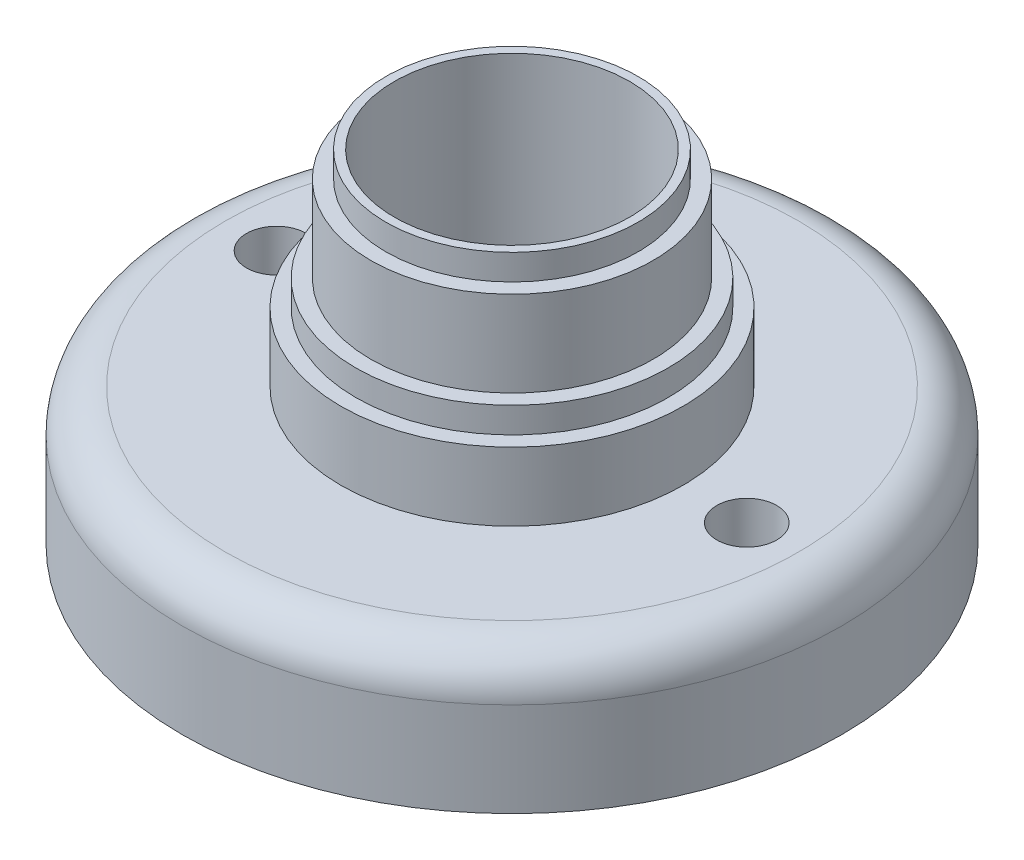
ISO-10303-21;
HEADER;
FILE_DESCRIPTION(('STEP AP214'),'2;1');
FILE_NAME('part.step','',(''),(''),'','','');
FILE_SCHEMA(('AUTOMOTIVE_DESIGN { 1 0 10303 214 1 1 1 1 }'));
ENDSEC;
DATA;
#1=APPLICATION_CONTEXT('core data for automotive mechanical design processes');
#2=APPLICATION_PROTOCOL_DEFINITION('international standard','automotive_design',2000,#1);
#3=PRODUCT_CONTEXT('',#1,'mechanical');
#4=PRODUCT('Part','Part','',(#3));
#5=PRODUCT_RELATED_PRODUCT_CATEGORY('part','',(#4));
#6=PRODUCT_DEFINITION_FORMATION('','',#4);
#7=PRODUCT_DEFINITION_CONTEXT('part definition',#1,'design');
#8=PRODUCT_DEFINITION('design','',#6,#7);
#9=PRODUCT_DEFINITION_SHAPE('','',#8);
#10=(LENGTH_UNIT() NAMED_UNIT(*) SI_UNIT(.MILLI.,.METRE.));
#11=(NAMED_UNIT(*) PLANE_ANGLE_UNIT() SI_UNIT($,.RADIAN.));
#12=(NAMED_UNIT(*) SI_UNIT($,.STERADIAN.) SOLID_ANGLE_UNIT());
#13=UNCERTAINTY_MEASURE_WITH_UNIT(LENGTH_MEASURE(1.E-05),#10,'distance_accuracy_value','');
#14=(GEOMETRIC_REPRESENTATION_CONTEXT(3) GLOBAL_UNCERTAINTY_ASSIGNED_CONTEXT((#13)) GLOBAL_UNIT_ASSIGNED_CONTEXT((#10,
#11,#12)) REPRESENTATION_CONTEXT('',''));
#15=CARTESIAN_POINT('',(0.,0.,0.));
#16=DIRECTION('',(0.,0.,1.));
#17=DIRECTION('',(1.,0.,0.));
#18=AXIS2_PLACEMENT_3D('',#15,#16,#17);
#19=CARTESIAN_POINT('',(0.,16.,0.));
#20=DIRECTION('',(0.,1.,0.));
#21=DIRECTION('',(0.,0.,1.));
#22=AXIS2_PLACEMENT_3D('',#19,#20,#21);
#23=PLANE('',#22);
#24=CARTESIAN_POINT('',(0.,16.,0.));
#25=DIRECTION('',(0.,-1.,0.));
#26=DIRECTION('',(0.,0.,-1.));
#27=AXIS2_PLACEMENT_3D('',#24,#25,#26);
#28=CIRCLE('',#27,13.75);
#29=CARTESIAN_POINT('',(0.,16.,-13.75));
#30=VERTEX_POINT('',#29);
#31=EDGE_CURVE('E20',#30,#30,#28,.F.);
#32=ORIENTED_EDGE('',*,*,#31,.T.);
#33=EDGE_LOOP('',(#32));
#34=FACE_BOUND('',#33,.T.);
#35=ADVANCED_FACE('F17',(#34),#23,.T.);
#36=CARTESIAN_POINT('',(0.,40.,0.));
#37=DIRECTION('',(0.,-1.,0.));
#38=DIRECTION('',(0.,0.,-1.));
#39=AXIS2_PLACEMENT_3D('',#36,#37,#38);
#40=CYLINDRICAL_SURFACE('',#39,13.75);
#41=ORIENTED_EDGE('',*,*,#31,.F.);
#42=EDGE_LOOP('',(#41));
#43=FACE_BOUND('',#42,.T.);
#44=CARTESIAN_POINT('',(0.,40.,0.));
#45=DIRECTION('',(0.,-1.,0.));
#46=DIRECTION('',(0.,0.,-1.));
#47=AXIS2_PLACEMENT_3D('',#44,#45,#46);
#48=CIRCLE('',#47,13.75);
#49=CARTESIAN_POINT('',(0.,40.,-13.75));
#50=VERTEX_POINT('',#49);
#51=EDGE_CURVE('E335',#50,#50,#48,.T.);
#52=ORIENTED_EDGE('',*,*,#51,.F.);
#53=EDGE_LOOP('',(#52));
#54=FACE_BOUND('',#53,.T.);
#55=ADVANCED_FACE('F192',(#43,#54),#40,.F.);
#56=CARTESIAN_POINT('',(0.,40.,0.));
#57=DIRECTION('',(0.,1.,0.));
#58=DIRECTION('',(0.,0.,1.));
#59=AXIS2_PLACEMENT_3D('',#56,#57,#58);
#60=PLANE('',#59);
#61=ORIENTED_EDGE('',*,*,#51,.T.);
#62=EDGE_LOOP('',(#61));
#63=FACE_BOUND('',#62,.T.);
#64=CARTESIAN_POINT('',(0.,40.,0.));
#65=DIRECTION('',(0.,1.,0.));
#66=DIRECTION('',(0.,0.,1.));
#67=AXIS2_PLACEMENT_3D('',#64,#65,#66);
#68=CIRCLE('',#67,14.75);
#69=CARTESIAN_POINT('',(0.,40.,14.75));
#70=VERTEX_POINT('',#69);
#71=EDGE_CURVE('E333',#70,#70,#68,.F.);
#72=ORIENTED_EDGE('',*,*,#71,.F.);
#73=EDGE_LOOP('',(#72));
#74=FACE_BOUND('',#73,.T.);
#75=ADVANCED_FACE('F189',(#63,#74),#60,.T.);
#76=CARTESIAN_POINT('',(0.,14.,0.));
#77=DIRECTION('',(0.,1.,0.));
#78=DIRECTION('',(0.,0.,1.));
#79=AXIS2_PLACEMENT_3D('',#76,#77,#78);
#80=PLANE('',#79);
#81=CARTESIAN_POINT('',(0.,14.,0.));
#82=DIRECTION('',(0.,-1.,0.));
#83=DIRECTION('',(0.,0.,-1.));
#84=AXIS2_PLACEMENT_3D('',#81,#82,#83);
#85=CIRCLE('',#84,15.75);
#86=CARTESIAN_POINT('',(0.,14.,-15.75));
#87=VERTEX_POINT('',#86);
#88=EDGE_CURVE('E330',#87,#87,#85,.F.);
#89=ORIENTED_EDGE('',*,*,#88,.F.);
#90=EDGE_LOOP('',(#89));
#91=FACE_BOUND('',#90,.T.);
#92=ADVANCED_FACE('F185',(#91),#80,.F.);
#93=CARTESIAN_POINT('',(0.,37.,0.));
#94=DIRECTION('',(0.,1.,0.));
#95=DIRECTION('',(0.,0.,1.));
#96=AXIS2_PLACEMENT_3D('',#93,#94,#95);
#97=CYLINDRICAL_SURFACE('',#96,14.75);
#98=CARTESIAN_POINT('',(0.,37.,0.));
#99=DIRECTION('',(0.,1.,0.));
#100=DIRECTION('',(0.,0.,1.));
#101=AXIS2_PLACEMENT_3D('',#98,#99,#100);
#102=CIRCLE('',#101,14.75);
#103=CARTESIAN_POINT('',(0.,37.,14.75));
#104=VERTEX_POINT('',#103);
#105=EDGE_CURVE('E327',#104,#104,#102,.F.);
#106=ORIENTED_EDGE('',*,*,#105,.F.);
#107=EDGE_LOOP('',(#106));
#108=FACE_BOUND('',#107,.T.);
#109=ORIENTED_EDGE('',*,*,#71,.T.);
#110=EDGE_LOOP('',(#109));
#111=FACE_BOUND('',#110,.T.);
#112=ADVANCED_FACE('F181',(#108,#111),#97,.T.);
#113=CARTESIAN_POINT('',(0.,40.,0.));
#114=DIRECTION('',(0.,-1.,0.));
#115=DIRECTION('',(0.,0.,-1.));
#116=AXIS2_PLACEMENT_3D('',#113,#114,#115);
#117=CYLINDRICAL_SURFACE('',#116,15.75);
#118=CARTESIAN_POINT('',(0.,25.,0.));
#119=DIRECTION('',(0.,-1.,0.));
#120=DIRECTION('',(0.,0.,-1.));
#121=AXIS2_PLACEMENT_3D('',#118,#119,#120);
#122=CIRCLE('',#121,15.75);
#123=CARTESIAN_POINT('',(0.,25.,-15.75));
#124=VERTEX_POINT('',#123);
#125=EDGE_CURVE('E324',#124,#124,#122,.T.);
#126=ORIENTED_EDGE('',*,*,#125,.T.);
#127=EDGE_LOOP('',(#126));
#128=FACE_BOUND('',#127,.T.);
#129=ORIENTED_EDGE('',*,*,#88,.T.);
#130=EDGE_LOOP('',(#129));
#131=FACE_BOUND('',#130,.T.);
#132=ADVANCED_FACE('F177',(#128,#131),#117,.T.);
#133=CARTESIAN_POINT('',(0.,37.,0.));
#134=DIRECTION('',(0.,1.,0.));
#135=DIRECTION('',(0.,0.,1.));
#136=AXIS2_PLACEMENT_3D('',#133,#134,#135);
#137=PLANE('',#136);
#138=ORIENTED_EDGE('',*,*,#105,.T.);
#139=EDGE_LOOP('',(#138));
#140=FACE_BOUND('',#139,.T.);
#141=CARTESIAN_POINT('',(0.,37.,0.));
#142=DIRECTION('',(0.,1.,0.));
#143=DIRECTION('',(0.,0.,1.));
#144=AXIS2_PLACEMENT_3D('',#141,#142,#143);
#145=CIRCLE('',#144,16.5);
#146=CARTESIAN_POINT('',(0.,37.,16.5));
#147=VERTEX_POINT('',#146);
#148=EDGE_CURVE('E321',#147,#147,#145,.F.);
#149=ORIENTED_EDGE('',*,*,#148,.F.);
#150=EDGE_LOOP('',(#149));
#151=FACE_BOUND('',#150,.T.);
#152=ADVANCED_FACE('F173',(#140,#151),#137,.T.);
#153=CARTESIAN_POINT('',(0.,25.,0.));
#154=DIRECTION('',(0.,1.,0.));
#155=DIRECTION('',(0.,0.,1.));
#156=AXIS2_PLACEMENT_3D('',#153,#154,#155);
#157=PLANE('',#156);
#158=ORIENTED_EDGE('',*,*,#125,.F.);
#159=EDGE_LOOP('',(#158));
#160=FACE_BOUND('',#159,.T.);
#161=CARTESIAN_POINT('',(0.,25.,0.));
#162=DIRECTION('',(0.,1.,0.));
#163=DIRECTION('',(0.,0.,1.));
#164=AXIS2_PLACEMENT_3D('',#161,#162,#163);
#165=CIRCLE('',#164,16.25);
#166=CARTESIAN_POINT('',(0.,25.,16.25));
#167=VERTEX_POINT('',#166);
#168=EDGE_CURVE('E318',#167,#167,#165,.F.);
#169=ORIENTED_EDGE('',*,*,#168,.T.);
#170=EDGE_LOOP('',(#169));
#171=FACE_BOUND('',#170,.T.);
#172=ADVANCED_FACE('F169',(#160,#171),#157,.F.);
#173=CARTESIAN_POINT('',(0.,27.,0.));
#174=DIRECTION('',(0.,1.,0.));
#175=DIRECTION('',(0.,0.,1.));
#176=AXIS2_PLACEMENT_3D('',#173,#174,#175);
#177=CYLINDRICAL_SURFACE('',#176,16.5);
#178=CARTESIAN_POINT('',(0.,27.,0.));
#179=DIRECTION('',(0.,1.,0.));
#180=DIRECTION('',(0.,0.,1.));
#181=AXIS2_PLACEMENT_3D('',#178,#179,#180);
#182=CIRCLE('',#181,16.5);
#183=CARTESIAN_POINT('',(0.,27.,16.5));
#184=VERTEX_POINT('',#183);
#185=EDGE_CURVE('E315',#184,#184,#182,.F.);
#186=ORIENTED_EDGE('',*,*,#185,.F.);
#187=EDGE_LOOP('',(#186));
#188=FACE_BOUND('',#187,.T.);
#189=ORIENTED_EDGE('',*,*,#148,.T.);
#190=EDGE_LOOP('',(#189));
#191=FACE_BOUND('',#190,.T.);
#192=ADVANCED_FACE('F165',(#188,#191),#177,.T.);
#193=CARTESIAN_POINT('',(0.,24.,0.));
#194=DIRECTION('',(0.,1.,0.));
#195=DIRECTION('',(0.,0.,1.));
#196=AXIS2_PLACEMENT_3D('',#193,#194,#195);
#197=CYLINDRICAL_SURFACE('',#196,16.25);
#198=ORIENTED_EDGE('',*,*,#168,.F.);
#199=EDGE_LOOP('',(#198));
#200=FACE_BOUND('',#199,.T.);
#201=CARTESIAN_POINT('',(0.,22.,0.));
#202=DIRECTION('',(0.,1.,0.));
#203=DIRECTION('',(0.,0.,1.));
#204=AXIS2_PLACEMENT_3D('',#201,#202,#203);
#205=CIRCLE('',#204,16.25);
#206=CARTESIAN_POINT('',(0.,22.,16.25));
#207=VERTEX_POINT('',#206);
#208=EDGE_CURVE('E312',#207,#207,#205,.F.);
#209=ORIENTED_EDGE('',*,*,#208,.T.);
#210=EDGE_LOOP('',(#209));
#211=FACE_BOUND('',#210,.T.);
#212=ADVANCED_FACE('F161',(#200,#211),#197,.F.);
#213=CARTESIAN_POINT('',(0.,27.,0.));
#214=DIRECTION('',(0.,1.,0.));
#215=DIRECTION('',(0.,0.,1.));
#216=AXIS2_PLACEMENT_3D('',#213,#214,#215);
#217=PLANE('',#216);
#218=ORIENTED_EDGE('',*,*,#185,.T.);
#219=EDGE_LOOP('',(#218));
#220=FACE_BOUND('',#219,.T.);
#221=CARTESIAN_POINT('',(0.,27.,0.));
#222=DIRECTION('',(0.,1.,0.));
#223=DIRECTION('',(0.,0.,1.));
#224=AXIS2_PLACEMENT_3D('',#221,#222,#223);
#225=CIRCLE('',#224,18.25);
#226=CARTESIAN_POINT('',(0.,27.,18.25));
#227=VERTEX_POINT('',#226);
#228=EDGE_CURVE('E309',#227,#227,#225,.F.);
#229=ORIENTED_EDGE('',*,*,#228,.F.);
#230=EDGE_LOOP('',(#229));
#231=FACE_BOUND('',#230,.T.);
#232=ADVANCED_FACE('F157',(#220,#231),#217,.T.);
#233=CARTESIAN_POINT('',(0.,22.,0.));
#234=DIRECTION('',(0.,1.,0.));
#235=DIRECTION('',(0.,0.,1.));
#236=AXIS2_PLACEMENT_3D('',#233,#234,#235);
#237=PLANE('',#236);
#238=ORIENTED_EDGE('',*,*,#208,.F.);
#239=EDGE_LOOP('',(#238));
#240=FACE_BOUND('',#239,.T.);
#241=CARTESIAN_POINT('',(0.,22.,0.));
#242=DIRECTION('',(0.,1.,0.));
#243=DIRECTION('',(0.,0.,1.));
#244=AXIS2_PLACEMENT_3D('',#241,#242,#243);
#245=CIRCLE('',#244,18.);
#246=CARTESIAN_POINT('',(0.,22.,18.));
#247=VERTEX_POINT('',#246);
#248=EDGE_CURVE('E300',#247,#247,#245,.F.);
#249=ORIENTED_EDGE('',*,*,#248,.T.);
#250=EDGE_LOOP('',(#249));
#251=FACE_BOUND('',#250,.T.);
#252=ADVANCED_FACE('F153',(#240,#251),#237,.F.);
#253=CARTESIAN_POINT('',(0.,0.,0.));
#254=DIRECTION('',(0.,1.,0.));
#255=DIRECTION('',(0.,0.,1.));
#256=AXIS2_PLACEMENT_3D('',#253,#254,#255);
#257=PLANE('',#256);
#258=CARTESIAN_POINT('',(27.5,0.,0.0696525800363961));
#259=DIRECTION('',(0.,-1.,0.));
#260=DIRECTION('',(0.,0.,-1.));
#261=AXIS2_PLACEMENT_3D('',#258,#259,#260);
#262=CIRCLE('',#261,2.);
#263=CARTESIAN_POINT('',(27.5,0.,-1.9303474199636));
#264=VERTEX_POINT('',#263);
#265=EDGE_CURVE('E306',#264,#264,#262,.F.);
#266=ORIENTED_EDGE('',*,*,#265,.T.);
#267=EDGE_LOOP('',(#266));
#268=FACE_BOUND('',#267,.T.);
#269=CARTESIAN_POINT('',(27.5,0.,0.0696525800363961));
#270=DIRECTION('',(0.,-1.,0.));
#271=DIRECTION('',(0.,0.,-1.));
#272=AXIS2_PLACEMENT_3D('',#269,#270,#271);
#273=CIRCLE('',#272,5.5);
#274=CARTESIAN_POINT('',(27.5,0.,-5.4303474199636));
#275=VERTEX_POINT('',#274);
#276=EDGE_CURVE('E297',#275,#275,#273,.F.);
#277=ORIENTED_EDGE('',*,*,#276,.F.);
#278=EDGE_LOOP('',(#277));
#279=FACE_BOUND('',#278,.T.);
#280=ADVANCED_FACE('F149',(#268,#279),#257,.F.);
#281=CARTESIAN_POINT('',(0.,0.,0.));
#282=DIRECTION('',(0.,1.,0.));
#283=DIRECTION('',(0.,0.,1.));
#284=AXIS2_PLACEMENT_3D('',#281,#282,#283);
#285=PLANE('',#284);
#286=CARTESIAN_POINT('',(-27.5,0.,0.0163971370722494));
#287=DIRECTION('',(0.,-1.,0.));
#288=DIRECTION('',(0.,0.,-1.));
#289=AXIS2_PLACEMENT_3D('',#286,#287,#288);
#290=CIRCLE('',#289,2.);
#291=CARTESIAN_POINT('',(-27.5,0.,-1.98360286292775));
#292=VERTEX_POINT('',#291);
#293=EDGE_CURVE('E303',#292,#292,#290,.F.);
#294=ORIENTED_EDGE('',*,*,#293,.T.);
#295=EDGE_LOOP('',(#294));
#296=FACE_BOUND('',#295,.T.);
#297=CARTESIAN_POINT('',(-27.5,0.,0.0163971370722494));
#298=DIRECTION('',(0.,-1.,0.));
#299=DIRECTION('',(0.,0.,-1.));
#300=AXIS2_PLACEMENT_3D('',#297,#298,#299);
#301=CIRCLE('',#300,5.5);
#302=CARTESIAN_POINT('',(-27.5,0.,-5.48360286292775));
#303=VERTEX_POINT('',#302);
#304=EDGE_CURVE('E294',#303,#303,#301,.F.);
#305=ORIENTED_EDGE('',*,*,#304,.F.);
#306=EDGE_LOOP('',(#305));
#307=FACE_BOUND('',#306,.T.);
#308=ADVANCED_FACE('F145',(#296,#307),#285,.F.);
#309=CARTESIAN_POINT('',(0.,24.,0.));
#310=DIRECTION('',(0.,1.,0.));
#311=DIRECTION('',(0.,0.,1.));
#312=AXIS2_PLACEMENT_3D('',#309,#310,#311);
#313=CYLINDRICAL_SURFACE('',#312,18.25);
#314=CARTESIAN_POINT('',(0.,24.,0.));
#315=DIRECTION('',(0.,1.,0.));
#316=DIRECTION('',(0.,0.,1.));
#317=AXIS2_PLACEMENT_3D('',#314,#315,#316);
#318=CIRCLE('',#317,18.25);
#319=CARTESIAN_POINT('',(0.,24.,18.25));
#320=VERTEX_POINT('',#319);
#321=EDGE_CURVE('E291',#320,#320,#318,.F.);
#322=ORIENTED_EDGE('',*,*,#321,.F.);
#323=EDGE_LOOP('',(#322));
#324=FACE_BOUND('',#323,.T.);
#325=ORIENTED_EDGE('',*,*,#228,.T.);
#326=EDGE_LOOP('',(#325));
#327=FACE_BOUND('',#326,.T.);
#328=ADVANCED_FACE('F141',(#324,#327),#313,.T.);
#329=CARTESIAN_POINT('',(27.5,16.,0.0696525800363961));
#330=DIRECTION('',(0.,-1.,0.));
#331=DIRECTION('',(0.,0.,-1.));
#332=AXIS2_PLACEMENT_3D('',#329,#330,#331);
#333=CYLINDRICAL_SURFACE('',#332,2.);
#334=ORIENTED_EDGE('',*,*,#265,.F.);
#335=EDGE_LOOP('',(#334));
#336=FACE_BOUND('',#335,.T.);
#337=CARTESIAN_POINT('',(27.5,1.,0.0696525800363961));
#338=DIRECTION('',(0.,-1.,0.));
#339=DIRECTION('',(0.,0.,-1.));
#340=AXIS2_PLACEMENT_3D('',#337,#338,#339);
#341=CIRCLE('',#340,2.);
#342=CARTESIAN_POINT('',(27.5,1.,-1.9303474199636));
#343=VERTEX_POINT('',#342);
#344=EDGE_CURVE('E288',#343,#343,#341,.T.);
#345=ORIENTED_EDGE('',*,*,#344,.F.);
#346=EDGE_LOOP('',(#345));
#347=FACE_BOUND('',#346,.T.);
#348=ADVANCED_FACE('F137',(#336,#347),#333,.F.);
#349=CARTESIAN_POINT('',(-27.5,16.,0.0163971370722494));
#350=DIRECTION('',(0.,-1.,0.));
#351=DIRECTION('',(0.,0.,-1.));
#352=AXIS2_PLACEMENT_3D('',#349,#350,#351);
#353=CYLINDRICAL_SURFACE('',#352,2.);
#354=ORIENTED_EDGE('',*,*,#293,.F.);
#355=EDGE_LOOP('',(#354));
#356=FACE_BOUND('',#355,.T.);
#357=CARTESIAN_POINT('',(-27.5,1.,0.0163971370722494));
#358=DIRECTION('',(0.,-1.,0.));
#359=DIRECTION('',(0.,0.,-1.));
#360=AXIS2_PLACEMENT_3D('',#357,#358,#359);
#361=CIRCLE('',#360,2.);
#362=CARTESIAN_POINT('',(-27.5,1.,-1.98360286292775));
#363=VERTEX_POINT('',#362);
#364=EDGE_CURVE('E285',#363,#363,#361,.T.);
#365=ORIENTED_EDGE('',*,*,#364,.F.);
#366=EDGE_LOOP('',(#365));
#367=FACE_BOUND('',#366,.T.);
#368=ADVANCED_FACE('F133',(#356,#367),#353,.F.);
#369=CARTESIAN_POINT('',(0.,16.,0.));
#370=DIRECTION('',(0.,1.,0.));
#371=DIRECTION('',(0.,0.,1.));
#372=AXIS2_PLACEMENT_3D('',#369,#370,#371);
#373=CYLINDRICAL_SURFACE('',#372,18.);
#374=ORIENTED_EDGE('',*,*,#248,.F.);
#375=EDGE_LOOP('',(#374));
#376=FACE_BOUND('',#375,.T.);
#377=CARTESIAN_POINT('',(0.,14.,0.));
#378=DIRECTION('',(0.,1.,0.));
#379=DIRECTION('',(0.,0.,1.));
#380=AXIS2_PLACEMENT_3D('',#377,#378,#379);
#381=CIRCLE('',#380,18.);
#382=CARTESIAN_POINT('',(0.,14.,18.));
#383=VERTEX_POINT('',#382);
#384=EDGE_CURVE('E282',#383,#383,#381,.F.);
#385=ORIENTED_EDGE('',*,*,#384,.T.);
#386=EDGE_LOOP('',(#385));
#387=FACE_BOUND('',#386,.T.);
#388=ADVANCED_FACE('F129',(#376,#387),#373,.F.);
#389=CARTESIAN_POINT('',(27.5,16.,0.0696525800363961));
#390=DIRECTION('',(0.,-1.,0.));
#391=DIRECTION('',(0.,0.,-1.));
#392=AXIS2_PLACEMENT_3D('',#389,#390,#391);
#393=CYLINDRICAL_SURFACE('',#392,5.5);
#394=CARTESIAN_POINT('',(27.5,14.,0.0696525800363961));
#395=DIRECTION('',(0.,-1.,0.));
#396=DIRECTION('',(0.,0.,-1.));
#397=AXIS2_PLACEMENT_3D('',#394,#395,#396);
#398=CIRCLE('',#397,5.5);
#399=CARTESIAN_POINT('',(27.5,14.,-5.4303474199636));
#400=VERTEX_POINT('',#399);
#401=EDGE_CURVE('E279',#400,#400,#398,.T.);
#402=ORIENTED_EDGE('',*,*,#401,.T.);
#403=EDGE_LOOP('',(#402));
#404=FACE_BOUND('',#403,.T.);
#405=ORIENTED_EDGE('',*,*,#276,.T.);
#406=EDGE_LOOP('',(#405));
#407=FACE_BOUND('',#406,.T.);
#408=ADVANCED_FACE('F125',(#404,#407),#393,.T.);
#409=CARTESIAN_POINT('',(-27.5,16.,0.0163971370722494));
#410=DIRECTION('',(0.,-1.,0.));
#411=DIRECTION('',(0.,0.,-1.));
#412=AXIS2_PLACEMENT_3D('',#409,#410,#411);
#413=CYLINDRICAL_SURFACE('',#412,5.5);
#414=CARTESIAN_POINT('',(-27.5,14.,0.0163971370722494));
#415=DIRECTION('',(0.,-1.,0.));
#416=DIRECTION('',(0.,0.,-1.));
#417=AXIS2_PLACEMENT_3D('',#414,#415,#416);
#418=CIRCLE('',#417,5.5);
#419=CARTESIAN_POINT('',(-27.5,14.,-5.48360286292775));
#420=VERTEX_POINT('',#419);
#421=EDGE_CURVE('E276',#420,#420,#418,.T.);
#422=ORIENTED_EDGE('',*,*,#421,.T.);
#423=EDGE_LOOP('',(#422));
#424=FACE_BOUND('',#423,.T.);
#425=ORIENTED_EDGE('',*,*,#304,.T.);
#426=EDGE_LOOP('',(#425));
#427=FACE_BOUND('',#426,.T.);
#428=ADVANCED_FACE('F121',(#424,#427),#413,.T.);
#429=CARTESIAN_POINT('',(0.,24.,0.));
#430=DIRECTION('',(0.,1.,0.));
#431=DIRECTION('',(0.,0.,1.));
#432=AXIS2_PLACEMENT_3D('',#429,#430,#431);
#433=PLANE('',#432);
#434=ORIENTED_EDGE('',*,*,#321,.T.);
#435=EDGE_LOOP('',(#434));
#436=FACE_BOUND('',#435,.T.);
#437=CARTESIAN_POINT('',(0.,24.,0.));
#438=DIRECTION('',(0.,1.,0.));
#439=DIRECTION('',(0.,0.,1.));
#440=AXIS2_PLACEMENT_3D('',#437,#438,#439);
#441=CIRCLE('',#440,20.);
#442=CARTESIAN_POINT('',(0.,24.,20.));
#443=VERTEX_POINT('',#442);
#444=EDGE_CURVE('E273',#443,#443,#441,.F.);
#445=ORIENTED_EDGE('',*,*,#444,.F.);
#446=EDGE_LOOP('',(#445));
#447=FACE_BOUND('',#446,.T.);
#448=ADVANCED_FACE('F117',(#436,#447),#433,.T.);
#449=CARTESIAN_POINT('',(27.5,1.,0.0696525800363962));
#450=DIRECTION('',(0.,1.,0.));
#451=DIRECTION('',(0.,0.,1.));
#452=AXIS2_PLACEMENT_3D('',#449,#450,#451);
#453=PLANE('',#452);
#454=ORIENTED_EDGE('',*,*,#344,.T.);
#455=EDGE_LOOP('',(#454));
#456=FACE_BOUND('',#455,.T.);
#457=CARTESIAN_POINT('',(27.5,1.,0.0696525800363961));
#458=DIRECTION('',(0.,-1.,0.));
#459=DIRECTION('',(0.,0.,-1.));
#460=AXIS2_PLACEMENT_3D('',#457,#458,#459);
#461=CIRCLE('',#460,3.5);
#462=CARTESIAN_POINT('',(27.5,1.,-3.4303474199636));
#463=VERTEX_POINT('',#462);
#464=EDGE_CURVE('E270',#463,#463,#461,.F.);
#465=ORIENTED_EDGE('',*,*,#464,.T.);
#466=EDGE_LOOP('',(#465));
#467=FACE_BOUND('',#466,.T.);
#468=ADVANCED_FACE('F113',(#456,#467),#453,.T.);
#469=CARTESIAN_POINT('',(-27.5,1.,0.0163971370722493));
#470=DIRECTION('',(0.,1.,0.));
#471=DIRECTION('',(0.,0.,1.));
#472=AXIS2_PLACEMENT_3D('',#469,#470,#471);
#473=PLANE('',#472);
#474=ORIENTED_EDGE('',*,*,#364,.T.);
#475=EDGE_LOOP('',(#474));
#476=FACE_BOUND('',#475,.T.);
#477=CARTESIAN_POINT('',(-27.5,1.,0.0163971370722494));
#478=DIRECTION('',(0.,-1.,0.));
#479=DIRECTION('',(0.,0.,-1.));
#480=AXIS2_PLACEMENT_3D('',#477,#478,#479);
#481=CIRCLE('',#480,3.5);
#482=CARTESIAN_POINT('',(-27.5,1.,-3.48360286292775));
#483=VERTEX_POINT('',#482);
#484=EDGE_CURVE('E57',#483,#483,#481,.F.);
#485=ORIENTED_EDGE('',*,*,#484,.T.);
#486=EDGE_LOOP('',(#485));
#487=FACE_BOUND('',#486,.T.);
#488=ADVANCED_FACE('F101',(#476,#487),#473,.T.);
#489=CARTESIAN_POINT('',(0.,14.,0.));
#490=DIRECTION('',(0.,1.,0.));
#491=DIRECTION('',(0.,0.,1.));
#492=AXIS2_PLACEMENT_3D('',#489,#490,#491);
#493=PLANE('',#492);
#494=ORIENTED_EDGE('',*,*,#421,.F.);
#495=EDGE_LOOP('',(#494));
#496=FACE_BOUND('',#495,.T.);
#497=ORIENTED_EDGE('',*,*,#401,.F.);
#498=EDGE_LOOP('',(#497));
#499=FACE_BOUND('',#498,.T.);
#500=ORIENTED_EDGE('',*,*,#384,.F.);
#501=EDGE_LOOP('',(#500));
#502=FACE_BOUND('',#501,.T.);
#503=CARTESIAN_POINT('',(0.,14.,0.));
#504=DIRECTION('',(0.,1.,0.));
#505=DIRECTION('',(-1.,0.,0.));
#506=AXIS2_PLACEMENT_3D('',#503,#504,#505);
#507=CIRCLE('',#506,33.5);
#508=CARTESIAN_POINT('',(0.,14.,-33.5));
#509=VERTEX_POINT('',#508);
#510=CARTESIAN_POINT('',(-33.5,14.,0.));
#511=VERTEX_POINT('',#510);
#512=EDGE_CURVE('E43',#509,#511,#507,.F.);
#513=ORIENTED_EDGE('',*,*,#512,.T.);
#514=CARTESIAN_POINT('',(0.,14.,0.));
#515=DIRECTION('',(0.,1.,0.));
#516=DIRECTION('',(0.,0.,-1.));
#517=AXIS2_PLACEMENT_3D('',#514,#515,#516);
#518=CIRCLE('',#517,33.5);
#519=EDGE_CURVE('E46',#511,#509,#518,.F.);
#520=ORIENTED_EDGE('',*,*,#519,.T.);
#521=EDGE_LOOP('',(#513,#520));
#522=FACE_BOUND('',#521,.T.);
#523=ADVANCED_FACE('F48',(#496,#499,#502,#522),#493,.F.);
#524=CARTESIAN_POINT('',(0.,16.,0.));
#525=DIRECTION('',(0.,1.,0.));
#526=DIRECTION('',(0.,0.,1.));
#527=AXIS2_PLACEMENT_3D('',#524,#525,#526);
#528=CYLINDRICAL_SURFACE('',#527,20.);
#529=CARTESIAN_POINT('',(0.,16.,0.));
#530=DIRECTION('',(0.,1.,0.));
#531=DIRECTION('',(0.,0.,1.));
#532=AXIS2_PLACEMENT_3D('',#529,#530,#531);
#533=CIRCLE('',#532,20.);
#534=CARTESIAN_POINT('',(0.,16.,20.));
#535=VERTEX_POINT('',#534);
#536=EDGE_CURVE('E51',#535,#535,#533,.F.);
#537=ORIENTED_EDGE('',*,*,#536,.F.);
#538=EDGE_LOOP('',(#537));
#539=FACE_BOUND('',#538,.T.);
#540=ORIENTED_EDGE('',*,*,#444,.T.);
#541=EDGE_LOOP('',(#540));
#542=FACE_BOUND('',#541,.T.);
#543=ADVANCED_FACE('F100',(#539,#542),#528,.T.);
#544=CARTESIAN_POINT('',(27.5,16.,0.0696525800363961));
#545=DIRECTION('',(0.,-1.,0.));
#546=DIRECTION('',(0.,0.,-1.));
#547=AXIS2_PLACEMENT_3D('',#544,#545,#546);
#548=CYLINDRICAL_SURFACE('',#547,3.5);
#549=ORIENTED_EDGE('',*,*,#464,.F.);
#550=EDGE_LOOP('',(#549));
#551=FACE_BOUND('',#550,.T.);
#552=CARTESIAN_POINT('',(27.5,16.,0.0696525800363961));
#553=DIRECTION('',(0.,-1.,0.));
#554=DIRECTION('',(0.,0.,-1.));
#555=AXIS2_PLACEMENT_3D('',#552,#553,#554);
#556=CIRCLE('',#555,3.5);
#557=CARTESIAN_POINT('',(27.5,16.,-3.4303474199636));
#558=VERTEX_POINT('',#557);
#559=EDGE_CURVE('E263',#558,#558,#556,.T.);
#560=ORIENTED_EDGE('',*,*,#559,.F.);
#561=EDGE_LOOP('',(#560));
#562=FACE_BOUND('',#561,.T.);
#563=ADVANCED_FACE('F369',(#551,#562),#548,.F.);
#564=CARTESIAN_POINT('',(-27.5,16.,0.0163971370722494));
#565=DIRECTION('',(0.,-1.,0.));
#566=DIRECTION('',(0.,0.,-1.));
#567=AXIS2_PLACEMENT_3D('',#564,#565,#566);
#568=CYLINDRICAL_SURFACE('',#567,3.5);
#569=ORIENTED_EDGE('',*,*,#484,.F.);
#570=EDGE_LOOP('',(#569));
#571=FACE_BOUND('',#570,.T.);
#572=CARTESIAN_POINT('',(-27.5,16.,0.0163971370722494));
#573=DIRECTION('',(0.,-1.,0.));
#574=DIRECTION('',(0.,0.,-1.));
#575=AXIS2_PLACEMENT_3D('',#572,#573,#574);
#576=CIRCLE('',#575,3.5);
#577=CARTESIAN_POINT('',(-27.5,16.,-3.48360286292775));
#578=VERTEX_POINT('',#577);
#579=EDGE_CURVE('E227',#578,#578,#576,.T.);
#580=ORIENTED_EDGE('',*,*,#579,.F.);
#581=EDGE_LOOP('',(#580));
#582=FACE_BOUND('',#581,.T.);
#583=ADVANCED_FACE('F77',(#571,#582),#568,.F.);
#584=CARTESIAN_POINT('',(0.,11.,0.));
#585=DIRECTION('',(0.,1.,0.));
#586=DIRECTION('',(0.,0.,1.));
#587=AXIS2_PLACEMENT_3D('',#584,#585,#586);
#588=TOROIDAL_SURFACE('',#587,33.5,3.);
#589=ORIENTED_EDGE('',*,*,#512,.F.);
#590=ORIENTED_EDGE('',*,*,#519,.F.);
#591=EDGE_LOOP('',(#589,#590));
#592=FACE_BOUND('',#591,.T.);
#593=CARTESIAN_POINT('',(0.,11.,0.));
#594=DIRECTION('',(0.,1.,0.));
#595=DIRECTION('',(0.,0.,1.));
#596=AXIS2_PLACEMENT_3D('',#593,#594,#595);
#597=CIRCLE('',#596,36.5);
#598=CARTESIAN_POINT('',(0.,11.,36.5));
#599=VERTEX_POINT('',#598);
#600=EDGE_CURVE('E224',#599,#599,#597,.F.);
#601=ORIENTED_EDGE('',*,*,#600,.T.);
#602=EDGE_LOOP('',(#601));
#603=FACE_BOUND('',#602,.T.);
#604=ADVANCED_FACE('F55',(#592,#603),#588,.F.);
#605=CARTESIAN_POINT('',(0.,16.,0.));
#606=DIRECTION('',(0.,1.,0.));
#607=DIRECTION('',(0.,0.,1.));
#608=AXIS2_PLACEMENT_3D('',#605,#606,#607);
#609=PLANE('',#608);
#610=ORIENTED_EDGE('',*,*,#579,.T.);
#611=EDGE_LOOP('',(#610));
#612=FACE_BOUND('',#611,.T.);
#613=ORIENTED_EDGE('',*,*,#559,.T.);
#614=EDGE_LOOP('',(#613));
#615=FACE_BOUND('',#614,.T.);
#616=ORIENTED_EDGE('',*,*,#536,.T.);
#617=EDGE_LOOP('',(#616));
#618=FACE_BOUND('',#617,.T.);
#619=CARTESIAN_POINT('',(0.,16.,0.));
#620=DIRECTION('',(0.,-1.,0.));
#621=DIRECTION('',(-1.,0.,0.));
#622=AXIS2_PLACEMENT_3D('',#619,#620,#621);
#623=CIRCLE('',#622,33.5);
#624=CARTESIAN_POINT('',(-33.5,16.,0.));
#625=VERTEX_POINT('',#624);
#626=CARTESIAN_POINT('',(0.,16.,-33.5));
#627=VERTEX_POINT('',#626);
#628=EDGE_CURVE('E34',#625,#627,#623,.T.);
#629=ORIENTED_EDGE('',*,*,#628,.F.);
#630=CARTESIAN_POINT('',(0.,16.,0.));
#631=DIRECTION('',(0.,-1.,0.));
#632=DIRECTION('',(0.,0.,-1.));
#633=AXIS2_PLACEMENT_3D('',#630,#631,#632);
#634=CIRCLE('',#633,33.5);
#635=EDGE_CURVE('E226',#627,#625,#634,.T.);
#636=ORIENTED_EDGE('',*,*,#635,.F.);
#637=EDGE_LOOP('',(#629,#636));
#638=FACE_BOUND('',#637,.T.);
#639=ADVANCED_FACE('F76',(#612,#615,#618,#638),#609,.T.);
#640=CARTESIAN_POINT('',(0.,0.,0.));
#641=DIRECTION('',(0.,1.,0.));
#642=DIRECTION('',(0.,0.,1.));
#643=AXIS2_PLACEMENT_3D('',#640,#641,#642);
#644=CYLINDRICAL_SURFACE('',#643,36.5);
#645=ORIENTED_EDGE('',*,*,#600,.F.);
#646=EDGE_LOOP('',(#645));
#647=FACE_BOUND('',#646,.T.);
#648=CARTESIAN_POINT('',(0.,0.,0.));
#649=DIRECTION('',(0.,1.,0.));
#650=DIRECTION('',(0.,0.,1.));
#651=AXIS2_PLACEMENT_3D('',#648,#649,#650);
#652=CIRCLE('',#651,36.5);
#653=CARTESIAN_POINT('',(0.,0.,36.5));
#654=VERTEX_POINT('',#653);
#655=EDGE_CURVE('E255',#654,#654,#652,.F.);
#656=ORIENTED_EDGE('',*,*,#655,.T.);
#657=EDGE_LOOP('',(#656));
#658=FACE_BOUND('',#657,.T.);
#659=ADVANCED_FACE('F218',(#647,#658),#644,.F.);
#660=CARTESIAN_POINT('',(0.,11.,0.));
#661=DIRECTION('',(0.,1.,0.));
#662=DIRECTION('',(0.,0.,1.));
#663=AXIS2_PLACEMENT_3D('',#660,#661,#662);
#664=TOROIDAL_SURFACE('',#663,33.5,5.);
#665=CARTESIAN_POINT('',(0.,11.,0.));
#666=DIRECTION('',(0.,1.,0.));
#667=DIRECTION('',(0.,0.,1.));
#668=AXIS2_PLACEMENT_3D('',#665,#666,#667);
#669=CIRCLE('',#668,38.5);
#670=CARTESIAN_POINT('',(0.,11.,38.5));
#671=VERTEX_POINT('',#670);
#672=EDGE_CURVE('E26',#671,#671,#669,.F.);
#673=ORIENTED_EDGE('',*,*,#672,.F.);
#674=EDGE_LOOP('',(#673));
#675=FACE_BOUND('',#674,.T.);
#676=ORIENTED_EDGE('',*,*,#628,.T.);
#677=ORIENTED_EDGE('',*,*,#635,.T.);
#678=EDGE_LOOP('',(#676,#677));
#679=FACE_BOUND('',#678,.T.);
#680=ADVANCED_FACE('F211',(#675,#679),#664,.T.);
#681=CARTESIAN_POINT('',(0.,0.,0.));
#682=DIRECTION('',(0.,1.,0.));
#683=DIRECTION('',(0.,0.,1.));
#684=AXIS2_PLACEMENT_3D('',#681,#682,#683);
#685=PLANE('',#684);
#686=ORIENTED_EDGE('',*,*,#655,.F.);
#687=EDGE_LOOP('',(#686));
#688=FACE_BOUND('',#687,.T.);
#689=CARTESIAN_POINT('',(0.,0.,0.));
#690=DIRECTION('',(0.,1.,0.));
#691=DIRECTION('',(0.,0.,1.));
#692=AXIS2_PLACEMENT_3D('',#689,#690,#691);
#693=CIRCLE('',#692,38.5);
#694=CARTESIAN_POINT('',(0.,0.,38.5));
#695=VERTEX_POINT('',#694);
#696=EDGE_CURVE('E11',#695,#695,#693,.T.);
#697=ORIENTED_EDGE('',*,*,#696,.F.);
#698=EDGE_LOOP('',(#697));
#699=FACE_BOUND('',#698,.T.);
#700=ADVANCED_FACE('F205',(#688,#699),#685,.F.);
#701=CARTESIAN_POINT('',(0.,0.,0.));
#702=DIRECTION('',(0.,1.,0.));
#703=DIRECTION('',(0.,0.,1.));
#704=AXIS2_PLACEMENT_3D('',#701,#702,#703);
#705=CYLINDRICAL_SURFACE('',#704,38.5);
#706=ORIENTED_EDGE('',*,*,#696,.T.);
#707=EDGE_LOOP('',(#706));
#708=FACE_BOUND('',#707,.T.);
#709=ORIENTED_EDGE('',*,*,#672,.T.);
#710=EDGE_LOOP('',(#709));
#711=FACE_BOUND('',#710,.T.);
#712=ADVANCED_FACE('F203',(#708,#711),#705,.T.);
#713=CLOSED_SHELL('',(#35,#55,#75,#92,#112,#132,#152,#172,#192,#212,#232,#252,#280,#308,#328,
#348,#368,#388,#408,#428,#448,#468,#488,#523,#543,#563,#583,#604,#639,#659,#680,#700,#712));
#714=MANIFOLD_SOLID_BREP('B1',#713);
#715=ADVANCED_BREP_SHAPE_REPRESENTATION('',(#18,#714),#14);
#716=SHAPE_DEFINITION_REPRESENTATION(#9,#715);
ENDSEC;
END-ISO-10303-21;
